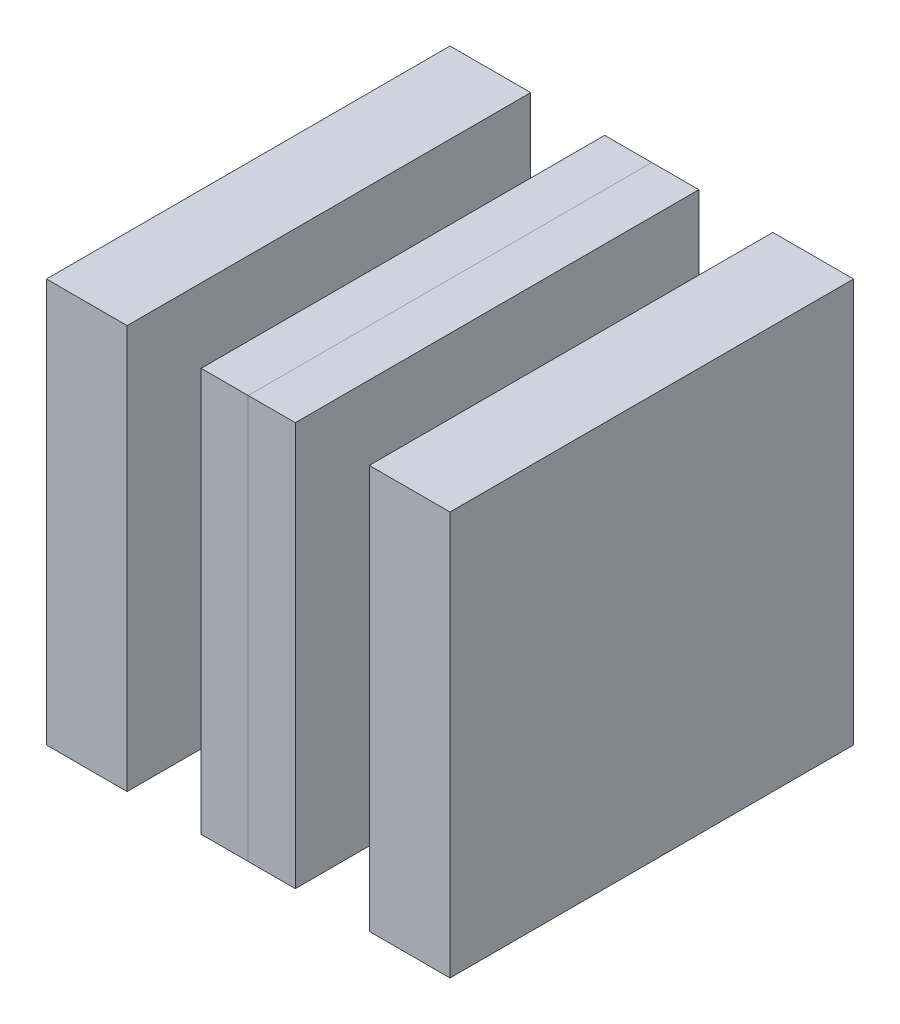
ISO-10303-21;
HEADER;
FILE_DESCRIPTION(('STEP AP214'),'2;1');
FILE_NAME('part.step','',(''),(''),'','','');
FILE_SCHEMA(('AUTOMOTIVE_DESIGN { 1 0 10303 214 1 1 1 1 }'));
ENDSEC;
DATA;
#1=APPLICATION_CONTEXT('core data for automotive mechanical design processes');
#2=APPLICATION_PROTOCOL_DEFINITION('international standard','automotive_design',2000,#1);
#3=PRODUCT_CONTEXT('',#1,'mechanical');
#4=PRODUCT('Part','Part','',(#3));
#5=PRODUCT_RELATED_PRODUCT_CATEGORY('part','',(#4));
#6=PRODUCT_DEFINITION_FORMATION('','',#4);
#7=PRODUCT_DEFINITION_CONTEXT('part definition',#1,'design');
#8=PRODUCT_DEFINITION('design','',#6,#7);
#9=PRODUCT_DEFINITION_SHAPE('','',#8);
#10=(LENGTH_UNIT() NAMED_UNIT(*) SI_UNIT(.MILLI.,.METRE.));
#11=(NAMED_UNIT(*) PLANE_ANGLE_UNIT() SI_UNIT($,.RADIAN.));
#12=(NAMED_UNIT(*) SI_UNIT($,.STERADIAN.) SOLID_ANGLE_UNIT());
#13=UNCERTAINTY_MEASURE_WITH_UNIT(LENGTH_MEASURE(1.E-05),#10,'distance_accuracy_value','');
#14=(GEOMETRIC_REPRESENTATION_CONTEXT(3) GLOBAL_UNCERTAINTY_ASSIGNED_CONTEXT((#13)) GLOBAL_UNIT_ASSIGNED_CONTEXT((#10,
#11,#12)) REPRESENTATION_CONTEXT('',''));
#15=CARTESIAN_POINT('',(0.,0.,0.));
#16=DIRECTION('',(0.,0.,1.));
#17=DIRECTION('',(1.,0.,0.));
#18=AXIS2_PLACEMENT_3D('',#15,#16,#17);
#19=CARTESIAN_POINT('',(15.,0.,15.));
#20=DIRECTION('',(-1.,0.,0.));
#21=DIRECTION('',(0.,0.,-1.));
#22=AXIS2_PLACEMENT_3D('',#19,#20,#21);
#23=PLANE('',#22);
#24=DIRECTION('',(0.,-1.,0.));
#25=VECTOR('',#24,1.);
#26=CARTESIAN_POINT('',(15.,0.,0.));
#27=LINE('',#26,#25);
#28=CARTESIAN_POINT('',(15.,15.,0.));
#29=VERTEX_POINT('',#28);
#30=CARTESIAN_POINT('',(15.,0.,0.));
#31=VERTEX_POINT('',#30);
#32=EDGE_CURVE('E107',#29,#31,#27,.T.);
#33=ORIENTED_EDGE('',*,*,#32,.F.);
#34=DIRECTION('',(0.,0.,-1.));
#35=VECTOR('',#34,1.);
#36=CARTESIAN_POINT('',(15.,15.,15.));
#37=LINE('',#36,#35);
#38=CARTESIAN_POINT('',(15.,15.,15.));
#39=VERTEX_POINT('',#38);
#40=EDGE_CURVE('E106',#39,#29,#37,.T.);
#41=ORIENTED_EDGE('',*,*,#40,.F.);
#42=DIRECTION('',(0.,-1.,0.));
#43=VECTOR('',#42,1.);
#44=CARTESIAN_POINT('',(15.,0.,15.));
#45=LINE('',#44,#43);
#46=CARTESIAN_POINT('',(15.,0.,15.));
#47=VERTEX_POINT('',#46);
#48=EDGE_CURVE('E101',#39,#47,#45,.T.);
#49=ORIENTED_EDGE('',*,*,#48,.T.);
#50=DIRECTION('',(0.,0.,-1.));
#51=VECTOR('',#50,1.);
#52=CARTESIAN_POINT('',(15.,0.,15.));
#53=LINE('',#52,#51);
#54=EDGE_CURVE('E12',#47,#31,#53,.T.);
#55=ORIENTED_EDGE('',*,*,#54,.T.);
#56=EDGE_LOOP('',(#33,#41,#49,#55));
#57=FACE_BOUND('',#56,.T.);
#58=ADVANCED_FACE('F44',(#57),#23,.F.);
#59=CARTESIAN_POINT('',(15.,0.,15.));
#60=DIRECTION('',(0.,1.,0.));
#61=DIRECTION('',(0.,0.,1.));
#62=AXIS2_PLACEMENT_3D('',#59,#60,#61);
#63=PLANE('',#62);
#64=DIRECTION('',(-1.,0.,0.));
#65=VECTOR('',#64,1.);
#66=CARTESIAN_POINT('',(15.,0.,0.));
#67=LINE('',#66,#65);
#68=CARTESIAN_POINT('',(12.,0.,0.));
#69=VERTEX_POINT('',#68);
#70=EDGE_CURVE('E109',#31,#69,#67,.T.);
#71=ORIENTED_EDGE('',*,*,#70,.F.);
#72=ORIENTED_EDGE('',*,*,#54,.F.);
#73=DIRECTION('',(-1.,0.,0.));
#74=VECTOR('',#73,1.);
#75=CARTESIAN_POINT('',(15.,0.,15.));
#76=LINE('',#75,#74);
#77=CARTESIAN_POINT('',(12.,0.,15.));
#78=VERTEX_POINT('',#77);
#79=EDGE_CURVE('E85',#47,#78,#76,.T.);
#80=ORIENTED_EDGE('',*,*,#79,.T.);
#81=DIRECTION('',(0.,0.,-1.));
#82=VECTOR('',#81,1.);
#83=CARTESIAN_POINT('',(12.,0.,15.));
#84=LINE('',#83,#82);
#85=EDGE_CURVE('E52',#78,#69,#84,.T.);
#86=ORIENTED_EDGE('',*,*,#85,.T.);
#87=EDGE_LOOP('',(#71,#72,#80,#86));
#88=FACE_BOUND('',#87,.T.);
#89=ADVANCED_FACE('F99',(#88),#63,.F.);
#90=CARTESIAN_POINT('',(12.,0.,15.));
#91=DIRECTION('',(1.,0.,0.));
#92=DIRECTION('',(0.,0.,1.));
#93=AXIS2_PLACEMENT_3D('',#90,#91,#92);
#94=PLANE('',#93);
#95=DIRECTION('',(0.,1.,0.));
#96=VECTOR('',#95,1.);
#97=CARTESIAN_POINT('',(12.,0.,0.));
#98=LINE('',#97,#96);
#99=CARTESIAN_POINT('',(12.,15.,0.));
#100=VERTEX_POINT('',#99);
#101=EDGE_CURVE('E95',#69,#100,#98,.T.);
#102=ORIENTED_EDGE('',*,*,#101,.F.);
#103=ORIENTED_EDGE('',*,*,#85,.F.);
#104=DIRECTION('',(0.,1.,0.));
#105=VECTOR('',#104,1.);
#106=CARTESIAN_POINT('',(12.,0.,15.));
#107=LINE('',#106,#105);
#108=CARTESIAN_POINT('',(12.,15.,15.));
#109=VERTEX_POINT('',#108);
#110=EDGE_CURVE('E88',#78,#109,#107,.T.);
#111=ORIENTED_EDGE('',*,*,#110,.T.);
#112=DIRECTION('',(0.,0.,-1.));
#113=VECTOR('',#112,1.);
#114=CARTESIAN_POINT('',(12.,15.,15.));
#115=LINE('',#114,#113);
#116=EDGE_CURVE('E98',#109,#100,#115,.T.);
#117=ORIENTED_EDGE('',*,*,#116,.T.);
#118=EDGE_LOOP('',(#102,#103,#111,#117));
#119=FACE_BOUND('',#118,.T.);
#120=ADVANCED_FACE('F94',(#119),#94,.F.);
#121=CARTESIAN_POINT('',(15.,15.,15.));
#122=DIRECTION('',(0.,-1.,0.));
#123=DIRECTION('',(0.,0.,-1.));
#124=AXIS2_PLACEMENT_3D('',#121,#122,#123);
#125=PLANE('',#124);
#126=DIRECTION('',(1.,0.,0.));
#127=VECTOR('',#126,1.);
#128=CARTESIAN_POINT('',(15.,15.,0.));
#129=LINE('',#128,#127);
#130=EDGE_CURVE('E74',#100,#29,#129,.T.);
#131=ORIENTED_EDGE('',*,*,#130,.F.);
#132=ORIENTED_EDGE('',*,*,#116,.F.);
#133=DIRECTION('',(1.,0.,0.));
#134=VECTOR('',#133,1.);
#135=CARTESIAN_POINT('',(15.,15.,15.));
#136=LINE('',#135,#134);
#137=EDGE_CURVE('E60',#109,#39,#136,.T.);
#138=ORIENTED_EDGE('',*,*,#137,.T.);
#139=ORIENTED_EDGE('',*,*,#40,.T.);
#140=EDGE_LOOP('',(#131,#132,#138,#139));
#141=FACE_BOUND('',#140,.T.);
#142=ADVANCED_FACE('F118',(#141),#125,.F.);
#143=CARTESIAN_POINT('',(15.,0.,15.));
#144=DIRECTION('',(0.,0.,-1.));
#145=DIRECTION('',(1.,0.,0.));
#146=AXIS2_PLACEMENT_3D('',#143,#144,#145);
#147=PLANE('',#146);
#148=ORIENTED_EDGE('',*,*,#48,.F.);
#149=ORIENTED_EDGE('',*,*,#137,.F.);
#150=ORIENTED_EDGE('',*,*,#110,.F.);
#151=ORIENTED_EDGE('',*,*,#79,.F.);
#152=EDGE_LOOP('',(#148,#149,#150,#151));
#153=FACE_BOUND('',#152,.T.);
#154=ADVANCED_FACE('F90',(#153),#147,.F.);
#155=CARTESIAN_POINT('',(15.,0.,0.));
#156=DIRECTION('',(0.,0.,-1.));
#157=DIRECTION('',(1.,0.,0.));
#158=AXIS2_PLACEMENT_3D('',#155,#156,#157);
#159=PLANE('',#158);
#160=ORIENTED_EDGE('',*,*,#32,.T.);
#161=ORIENTED_EDGE('',*,*,#70,.T.);
#162=ORIENTED_EDGE('',*,*,#101,.T.);
#163=ORIENTED_EDGE('',*,*,#130,.T.);
#164=EDGE_LOOP('',(#160,#161,#162,#163));
#165=FACE_BOUND('',#164,.T.);
#166=ADVANCED_FACE('F114',(#165),#159,.T.);
#167=CLOSED_SHELL('',(#58,#89,#120,#142,#154,#166));
#168=MANIFOLD_SOLID_BREP('B2',#167);
#169=CARTESIAN_POINT('',(9.25,15.,15.));
#170=DIRECTION('',(-1.,0.,0.));
#171=DIRECTION('',(0.,1.,0.));
#172=AXIS2_PLACEMENT_3D('',#169,#170,#171);
#173=PLANE('',#172);
#174=DIRECTION('',(0.,-1.,0.));
#175=VECTOR('',#174,1.);
#176=CARTESIAN_POINT('',(9.25,15.,0.));
#177=LINE('',#176,#175);
#178=CARTESIAN_POINT('',(9.25,15.,0.));
#179=VERTEX_POINT('',#178);
#180=CARTESIAN_POINT('',(9.25,0.,0.));
#181=VERTEX_POINT('',#180);
#182=EDGE_CURVE('E241',#179,#181,#177,.T.);
#183=ORIENTED_EDGE('',*,*,#182,.F.);
#184=DIRECTION('',(0.,0.,-1.));
#185=VECTOR('',#184,1.);
#186=CARTESIAN_POINT('',(9.25,15.,15.));
#187=LINE('',#186,#185);
#188=CARTESIAN_POINT('',(9.25,15.,15.));
#189=VERTEX_POINT('',#188);
#190=EDGE_CURVE('E240',#189,#179,#187,.T.);
#191=ORIENTED_EDGE('',*,*,#190,.F.);
#192=DIRECTION('',(0.,-1.,0.));
#193=VECTOR('',#192,1.);
#194=CARTESIAN_POINT('',(9.25,15.,15.));
#195=LINE('',#194,#193);
#196=CARTESIAN_POINT('',(9.25,0.,15.));
#197=VERTEX_POINT('',#196);
#198=EDGE_CURVE('E235',#189,#197,#195,.T.);
#199=ORIENTED_EDGE('',*,*,#198,.T.);
#200=DIRECTION('',(0.,0.,-1.));
#201=VECTOR('',#200,1.);
#202=CARTESIAN_POINT('',(9.25,0.,15.));
#203=LINE('',#202,#201);
#204=EDGE_CURVE('E42',#197,#181,#203,.T.);
#205=ORIENTED_EDGE('',*,*,#204,.T.);
#206=EDGE_LOOP('',(#183,#191,#199,#205));
#207=FACE_BOUND('',#206,.T.);
#208=ADVANCED_FACE('F178',(#207),#173,.F.);
#209=CARTESIAN_POINT('',(9.25,0.,15.));
#210=DIRECTION('',(0.,1.,0.));
#211=DIRECTION('',(0.,0.,1.));
#212=AXIS2_PLACEMENT_3D('',#209,#210,#211);
#213=PLANE('',#212);
#214=DIRECTION('',(-1.,0.,0.));
#215=VECTOR('',#214,1.);
#216=CARTESIAN_POINT('',(9.25,0.,0.));
#217=LINE('',#216,#215);
#218=CARTESIAN_POINT('',(7.5,0.,0.));
#219=VERTEX_POINT('',#218);
#220=EDGE_CURVE('E243',#181,#219,#217,.T.);
#221=ORIENTED_EDGE('',*,*,#220,.F.);
#222=ORIENTED_EDGE('',*,*,#204,.F.);
#223=DIRECTION('',(-1.,0.,0.));
#224=VECTOR('',#223,1.);
#225=CARTESIAN_POINT('',(9.25,0.,15.));
#226=LINE('',#225,#224);
#227=CARTESIAN_POINT('',(7.5,0.,15.));
#228=VERTEX_POINT('',#227);
#229=EDGE_CURVE('E219',#197,#228,#226,.T.);
#230=ORIENTED_EDGE('',*,*,#229,.T.);
#231=DIRECTION('',(0.,0.,-1.));
#232=VECTOR('',#231,1.);
#233=CARTESIAN_POINT('',(7.5,0.,15.));
#234=LINE('',#233,#232);
#235=EDGE_CURVE('E186',#228,#219,#234,.T.);
#236=ORIENTED_EDGE('',*,*,#235,.T.);
#237=EDGE_LOOP('',(#221,#222,#230,#236));
#238=FACE_BOUND('',#237,.T.);
#239=ADVANCED_FACE('F233',(#238),#213,.F.);
#240=CARTESIAN_POINT('',(7.5,15.,15.));
#241=DIRECTION('',(1.,0.,0.));
#242=DIRECTION('',(0.,-1.,0.));
#243=AXIS2_PLACEMENT_3D('',#240,#241,#242);
#244=PLANE('',#243);
#245=DIRECTION('',(0.,1.,0.));
#246=VECTOR('',#245,1.);
#247=CARTESIAN_POINT('',(7.5,15.,0.));
#248=LINE('',#247,#246);
#249=CARTESIAN_POINT('',(7.5,15.,0.));
#250=VERTEX_POINT('',#249);
#251=EDGE_CURVE('E229',#219,#250,#248,.T.);
#252=ORIENTED_EDGE('',*,*,#251,.F.);
#253=ORIENTED_EDGE('',*,*,#235,.F.);
#254=DIRECTION('',(0.,1.,0.));
#255=VECTOR('',#254,1.);
#256=CARTESIAN_POINT('',(7.5,15.,15.));
#257=LINE('',#256,#255);
#258=CARTESIAN_POINT('',(7.5,15.,15.));
#259=VERTEX_POINT('',#258);
#260=EDGE_CURVE('E222',#228,#259,#257,.T.);
#261=ORIENTED_EDGE('',*,*,#260,.T.);
#262=DIRECTION('',(0.,0.,-1.));
#263=VECTOR('',#262,1.);
#264=CARTESIAN_POINT('',(7.5,15.,15.));
#265=LINE('',#264,#263);
#266=EDGE_CURVE('E232',#259,#250,#265,.T.);
#267=ORIENTED_EDGE('',*,*,#266,.T.);
#268=EDGE_LOOP('',(#252,#253,#261,#267));
#269=FACE_BOUND('',#268,.T.);
#270=ADVANCED_FACE('F228',(#269),#244,.F.);
#271=CARTESIAN_POINT('',(9.25,15.,15.));
#272=DIRECTION('',(0.,-1.,0.));
#273=DIRECTION('',(0.,0.,-1.));
#274=AXIS2_PLACEMENT_3D('',#271,#272,#273);
#275=PLANE('',#274);
#276=DIRECTION('',(1.,0.,0.));
#277=VECTOR('',#276,1.);
#278=CARTESIAN_POINT('',(9.25,15.,0.));
#279=LINE('',#278,#277);
#280=EDGE_CURVE('E208',#250,#179,#279,.T.);
#281=ORIENTED_EDGE('',*,*,#280,.F.);
#282=ORIENTED_EDGE('',*,*,#266,.F.);
#283=DIRECTION('',(1.,0.,0.));
#284=VECTOR('',#283,1.);
#285=CARTESIAN_POINT('',(9.25,15.,15.));
#286=LINE('',#285,#284);
#287=EDGE_CURVE('E194',#259,#189,#286,.T.);
#288=ORIENTED_EDGE('',*,*,#287,.T.);
#289=ORIENTED_EDGE('',*,*,#190,.T.);
#290=EDGE_LOOP('',(#281,#282,#288,#289));
#291=FACE_BOUND('',#290,.T.);
#292=ADVANCED_FACE('F252',(#291),#275,.F.);
#293=CARTESIAN_POINT('',(15.,0.,15.));
#294=DIRECTION('',(0.,0.,1.));
#295=DIRECTION('',(-1.,0.,0.));
#296=AXIS2_PLACEMENT_3D('',#293,#294,#295);
#297=PLANE('',#296);
#298=ORIENTED_EDGE('',*,*,#198,.F.);
#299=ORIENTED_EDGE('',*,*,#287,.F.);
#300=ORIENTED_EDGE('',*,*,#260,.F.);
#301=ORIENTED_EDGE('',*,*,#229,.F.);
#302=EDGE_LOOP('',(#298,#299,#300,#301));
#303=FACE_BOUND('',#302,.T.);
#304=ADVANCED_FACE('F224',(#303),#297,.T.);
#305=CARTESIAN_POINT('',(15.,0.,0.));
#306=DIRECTION('',(0.,0.,1.));
#307=DIRECTION('',(-1.,0.,0.));
#308=AXIS2_PLACEMENT_3D('',#305,#306,#307);
#309=PLANE('',#308);
#310=ORIENTED_EDGE('',*,*,#182,.T.);
#311=ORIENTED_EDGE('',*,*,#220,.T.);
#312=ORIENTED_EDGE('',*,*,#251,.T.);
#313=ORIENTED_EDGE('',*,*,#280,.T.);
#314=EDGE_LOOP('',(#310,#311,#312,#313));
#315=FACE_BOUND('',#314,.T.);
#316=ADVANCED_FACE('F248',(#315),#309,.F.);
#317=CLOSED_SHELL('',(#208,#239,#270,#292,#304,#316));
#318=MANIFOLD_SOLID_BREP('B6',#317);
#319=CARTESIAN_POINT('',(5.75,15.,15.));
#320=DIRECTION('',(1.,0.,0.));
#321=DIRECTION('',(0.,1.,0.));
#322=AXIS2_PLACEMENT_3D('',#319,#320,#321);
#323=PLANE('',#322);
#324=DIRECTION('',(0.,-1.,0.));
#325=VECTOR('',#324,1.);
#326=CARTESIAN_POINT('',(5.75,15.,0.));
#327=LINE('',#326,#325);
#328=CARTESIAN_POINT('',(5.75,15.,0.));
#329=VERTEX_POINT('',#328);
#330=CARTESIAN_POINT('',(5.75,0.,0.));
#331=VERTEX_POINT('',#330);
#332=EDGE_CURVE('E374',#329,#331,#327,.T.);
#333=ORIENTED_EDGE('',*,*,#332,.T.);
#334=DIRECTION('',(0.,0.,-1.));
#335=VECTOR('',#334,1.);
#336=CARTESIAN_POINT('',(5.75,0.,15.));
#337=LINE('',#336,#335);
#338=CARTESIAN_POINT('',(5.75,0.,15.));
#339=VERTEX_POINT('',#338);
#340=EDGE_CURVE('E176',#339,#331,#337,.T.);
#341=ORIENTED_EDGE('',*,*,#340,.F.);
#342=DIRECTION('',(0.,-1.,0.));
#343=VECTOR('',#342,1.);
#344=CARTESIAN_POINT('',(5.75,15.,15.));
#345=LINE('',#344,#343);
#346=CARTESIAN_POINT('',(5.75,15.,15.));
#347=VERTEX_POINT('',#346);
#348=EDGE_CURVE('E362',#347,#339,#345,.T.);
#349=ORIENTED_EDGE('',*,*,#348,.F.);
#350=DIRECTION('',(0.,0.,-1.));
#351=VECTOR('',#350,1.);
#352=CARTESIAN_POINT('',(5.75,15.,15.));
#353=LINE('',#352,#351);
#354=EDGE_CURVE('E370',#347,#329,#353,.T.);
#355=ORIENTED_EDGE('',*,*,#354,.T.);
#356=EDGE_LOOP('',(#333,#341,#349,#355));
#357=FACE_BOUND('',#356,.T.);
#358=ADVANCED_FACE('F311',(#357),#323,.F.);
#359=CARTESIAN_POINT('',(5.75,0.,15.));
#360=DIRECTION('',(0.,1.,0.));
#361=DIRECTION('',(0.,0.,1.));
#362=AXIS2_PLACEMENT_3D('',#359,#360,#361);
#363=PLANE('',#362);
#364=DIRECTION('',(1.,0.,0.));
#365=VECTOR('',#364,1.);
#366=CARTESIAN_POINT('',(5.75,0.,0.));
#367=LINE('',#366,#365);
#368=CARTESIAN_POINT('',(7.5,0.,0.));
#369=VERTEX_POINT('',#368);
#370=EDGE_CURVE('E366',#331,#369,#367,.T.);
#371=ORIENTED_EDGE('',*,*,#370,.T.);
#372=DIRECTION('',(0.,0.,-1.));
#373=VECTOR('',#372,1.);
#374=CARTESIAN_POINT('',(7.5,0.,15.));
#375=LINE('',#374,#373);
#376=CARTESIAN_POINT('',(7.5,0.,15.));
#377=VERTEX_POINT('',#376);
#378=EDGE_CURVE('E319',#377,#369,#375,.T.);
#379=ORIENTED_EDGE('',*,*,#378,.F.);
#380=DIRECTION('',(1.,0.,0.));
#381=VECTOR('',#380,1.);
#382=CARTESIAN_POINT('',(5.75,0.,15.));
#383=LINE('',#382,#381);
#384=EDGE_CURVE('E357',#339,#377,#383,.T.);
#385=ORIENTED_EDGE('',*,*,#384,.F.);
#386=ORIENTED_EDGE('',*,*,#340,.T.);
#387=EDGE_LOOP('',(#371,#379,#385,#386));
#388=FACE_BOUND('',#387,.T.);
#389=ADVANCED_FACE('F365',(#388),#363,.F.);
#390=CARTESIAN_POINT('',(7.5,15.,15.));
#391=DIRECTION('',(-1.,0.,0.));
#392=DIRECTION('',(0.,-1.,0.));
#393=AXIS2_PLACEMENT_3D('',#390,#391,#392);
#394=PLANE('',#393);
#395=DIRECTION('',(0.,1.,0.));
#396=VECTOR('',#395,1.);
#397=CARTESIAN_POINT('',(7.5,15.,0.));
#398=LINE('',#397,#396);
#399=CARTESIAN_POINT('',(7.5,15.,0.));
#400=VERTEX_POINT('',#399);
#401=EDGE_CURVE('E344',#369,#400,#398,.T.);
#402=ORIENTED_EDGE('',*,*,#401,.T.);
#403=DIRECTION('',(0.,0.,-1.));
#404=VECTOR('',#403,1.);
#405=CARTESIAN_POINT('',(7.5,15.,15.));
#406=LINE('',#405,#404);
#407=CARTESIAN_POINT('',(7.5,15.,15.));
#408=VERTEX_POINT('',#407);
#409=EDGE_CURVE('E367',#408,#400,#406,.T.);
#410=ORIENTED_EDGE('',*,*,#409,.F.);
#411=DIRECTION('',(0.,1.,0.));
#412=VECTOR('',#411,1.);
#413=CARTESIAN_POINT('',(7.5,15.,15.));
#414=LINE('',#413,#412);
#415=EDGE_CURVE('E360',#377,#408,#414,.T.);
#416=ORIENTED_EDGE('',*,*,#415,.F.);
#417=ORIENTED_EDGE('',*,*,#378,.T.);
#418=EDGE_LOOP('',(#402,#410,#416,#417));
#419=FACE_BOUND('',#418,.T.);
#420=ADVANCED_FACE('F368',(#419),#394,.F.);
#421=CARTESIAN_POINT('',(5.75,15.,15.));
#422=DIRECTION('',(0.,-1.,0.));
#423=DIRECTION('',(0.,0.,-1.));
#424=AXIS2_PLACEMENT_3D('',#421,#422,#423);
#425=PLANE('',#424);
#426=DIRECTION('',(-1.,0.,0.));
#427=VECTOR('',#426,1.);
#428=CARTESIAN_POINT('',(5.75,15.,0.));
#429=LINE('',#428,#427);
#430=EDGE_CURVE('E350',#400,#329,#429,.T.);
#431=ORIENTED_EDGE('',*,*,#430,.T.);
#432=ORIENTED_EDGE('',*,*,#354,.F.);
#433=DIRECTION('',(-1.,0.,0.));
#434=VECTOR('',#433,1.);
#435=CARTESIAN_POINT('',(5.75,15.,15.));
#436=LINE('',#435,#434);
#437=EDGE_CURVE('E327',#408,#347,#436,.T.);
#438=ORIENTED_EDGE('',*,*,#437,.F.);
#439=ORIENTED_EDGE('',*,*,#409,.T.);
#440=EDGE_LOOP('',(#431,#432,#438,#439));
#441=FACE_BOUND('',#440,.T.);
#442=ADVANCED_FACE('F381',(#441),#425,.F.);
#443=CARTESIAN_POINT('',(0.,0.,15.));
#444=DIRECTION('',(0.,0.,1.));
#445=DIRECTION('',(1.,0.,0.));
#446=AXIS2_PLACEMENT_3D('',#443,#444,#445);
#447=PLANE('',#446);
#448=ORIENTED_EDGE('',*,*,#348,.T.);
#449=ORIENTED_EDGE('',*,*,#384,.T.);
#450=ORIENTED_EDGE('',*,*,#415,.T.);
#451=ORIENTED_EDGE('',*,*,#437,.T.);
#452=EDGE_LOOP('',(#448,#449,#450,#451));
#453=FACE_BOUND('',#452,.T.);
#454=ADVANCED_FACE('F358',(#453),#447,.T.);
#455=CARTESIAN_POINT('',(0.,0.,0.));
#456=DIRECTION('',(0.,0.,1.));
#457=DIRECTION('',(1.,0.,0.));
#458=AXIS2_PLACEMENT_3D('',#455,#456,#457);
#459=PLANE('',#458);
#460=ORIENTED_EDGE('',*,*,#332,.F.);
#461=ORIENTED_EDGE('',*,*,#430,.F.);
#462=ORIENTED_EDGE('',*,*,#401,.F.);
#463=ORIENTED_EDGE('',*,*,#370,.F.);
#464=EDGE_LOOP('',(#460,#461,#462,#463));
#465=FACE_BOUND('',#464,.T.);
#466=ADVANCED_FACE('F384',(#465),#459,.F.);
#467=CLOSED_SHELL('',(#358,#389,#420,#442,#454,#466));
#468=MANIFOLD_SOLID_BREP('B36',#467);
#469=CARTESIAN_POINT('',(0.,0.,15.));
#470=DIRECTION('',(1.,0.,0.));
#471=DIRECTION('',(0.,0.,-1.));
#472=AXIS2_PLACEMENT_3D('',#469,#470,#471);
#473=PLANE('',#472);
#474=DIRECTION('',(0.,-1.,0.));
#475=VECTOR('',#474,1.);
#476=CARTESIAN_POINT('',(0.,0.,0.));
#477=LINE('',#476,#475);
#478=CARTESIAN_POINT('',(0.,15.,0.));
#479=VERTEX_POINT('',#478);
#480=CARTESIAN_POINT('',(0.,0.,0.));
#481=VERTEX_POINT('',#480);
#482=EDGE_CURVE('E498',#479,#481,#477,.T.);
#483=ORIENTED_EDGE('',*,*,#482,.T.);
#484=DIRECTION('',(0.,0.,-1.));
#485=VECTOR('',#484,1.);
#486=CARTESIAN_POINT('',(0.,0.,15.));
#487=LINE('',#486,#485);
#488=CARTESIAN_POINT('',(0.,0.,15.));
#489=VERTEX_POINT('',#488);
#490=EDGE_CURVE('E309',#489,#481,#487,.T.);
#491=ORIENTED_EDGE('',*,*,#490,.F.);
#492=DIRECTION('',(0.,-1.,0.));
#493=VECTOR('',#492,1.);
#494=CARTESIAN_POINT('',(0.,0.,15.));
#495=LINE('',#494,#493);
#496=CARTESIAN_POINT('',(0.,15.,15.));
#497=VERTEX_POINT('',#496);
#498=EDGE_CURVE('E486',#497,#489,#495,.T.);
#499=ORIENTED_EDGE('',*,*,#498,.F.);
#500=DIRECTION('',(0.,0.,-1.));
#501=VECTOR('',#500,1.);
#502=CARTESIAN_POINT('',(0.,15.,15.));
#503=LINE('',#502,#501);
#504=EDGE_CURVE('E494',#497,#479,#503,.T.);
#505=ORIENTED_EDGE('',*,*,#504,.T.);
#506=EDGE_LOOP('',(#483,#491,#499,#505));
#507=FACE_BOUND('',#506,.T.);
#508=ADVANCED_FACE('F435',(#507),#473,.F.);
#509=CARTESIAN_POINT('',(0.,0.,15.));
#510=DIRECTION('',(0.,1.,0.));
#511=DIRECTION('',(0.,0.,1.));
#512=AXIS2_PLACEMENT_3D('',#509,#510,#511);
#513=PLANE('',#512);
#514=DIRECTION('',(1.,0.,0.));
#515=VECTOR('',#514,1.);
#516=CARTESIAN_POINT('',(0.,0.,0.));
#517=LINE('',#516,#515);
#518=CARTESIAN_POINT('',(3.,0.,0.));
#519=VERTEX_POINT('',#518);
#520=EDGE_CURVE('E490',#481,#519,#517,.T.);
#521=ORIENTED_EDGE('',*,*,#520,.T.);
#522=DIRECTION('',(0.,0.,-1.));
#523=VECTOR('',#522,1.);
#524=CARTESIAN_POINT('',(3.,0.,15.));
#525=LINE('',#524,#523);
#526=CARTESIAN_POINT('',(3.,0.,15.));
#527=VERTEX_POINT('',#526);
#528=EDGE_CURVE('E443',#527,#519,#525,.T.);
#529=ORIENTED_EDGE('',*,*,#528,.F.);
#530=DIRECTION('',(1.,0.,0.));
#531=VECTOR('',#530,1.);
#532=CARTESIAN_POINT('',(0.,0.,15.));
#533=LINE('',#532,#531);
#534=EDGE_CURVE('E481',#489,#527,#533,.T.);
#535=ORIENTED_EDGE('',*,*,#534,.F.);
#536=ORIENTED_EDGE('',*,*,#490,.T.);
#537=EDGE_LOOP('',(#521,#529,#535,#536));
#538=FACE_BOUND('',#537,.T.);
#539=ADVANCED_FACE('F489',(#538),#513,.F.);
#540=CARTESIAN_POINT('',(3.,0.,15.));
#541=DIRECTION('',(-1.,0.,0.));
#542=DIRECTION('',(0.,0.,1.));
#543=AXIS2_PLACEMENT_3D('',#540,#541,#542);
#544=PLANE('',#543);
#545=DIRECTION('',(0.,1.,0.));
#546=VECTOR('',#545,1.);
#547=CARTESIAN_POINT('',(3.,0.,0.));
#548=LINE('',#547,#546);
#549=CARTESIAN_POINT('',(3.,15.,0.));
#550=VERTEX_POINT('',#549);
#551=EDGE_CURVE('E468',#519,#550,#548,.T.);
#552=ORIENTED_EDGE('',*,*,#551,.T.);
#553=DIRECTION('',(0.,0.,-1.));
#554=VECTOR('',#553,1.);
#555=CARTESIAN_POINT('',(3.,15.,15.));
#556=LINE('',#555,#554);
#557=CARTESIAN_POINT('',(3.,15.,15.));
#558=VERTEX_POINT('',#557);
#559=EDGE_CURVE('E491',#558,#550,#556,.T.);
#560=ORIENTED_EDGE('',*,*,#559,.F.);
#561=DIRECTION('',(0.,1.,0.));
#562=VECTOR('',#561,1.);
#563=CARTESIAN_POINT('',(3.,0.,15.));
#564=LINE('',#563,#562);
#565=EDGE_CURVE('E484',#527,#558,#564,.T.);
#566=ORIENTED_EDGE('',*,*,#565,.F.);
#567=ORIENTED_EDGE('',*,*,#528,.T.);
#568=EDGE_LOOP('',(#552,#560,#566,#567));
#569=FACE_BOUND('',#568,.T.);
#570=ADVANCED_FACE('F492',(#569),#544,.F.);
#571=CARTESIAN_POINT('',(0.,15.,15.));
#572=DIRECTION('',(0.,-1.,0.));
#573=DIRECTION('',(0.,0.,-1.));
#574=AXIS2_PLACEMENT_3D('',#571,#572,#573);
#575=PLANE('',#574);
#576=DIRECTION('',(-1.,0.,0.));
#577=VECTOR('',#576,1.);
#578=CARTESIAN_POINT('',(0.,15.,0.));
#579=LINE('',#578,#577);
#580=EDGE_CURVE('E474',#550,#479,#579,.T.);
#581=ORIENTED_EDGE('',*,*,#580,.T.);
#582=ORIENTED_EDGE('',*,*,#504,.F.);
#583=DIRECTION('',(-1.,0.,0.));
#584=VECTOR('',#583,1.);
#585=CARTESIAN_POINT('',(0.,15.,15.));
#586=LINE('',#585,#584);
#587=EDGE_CURVE('E451',#558,#497,#586,.T.);
#588=ORIENTED_EDGE('',*,*,#587,.F.);
#589=ORIENTED_EDGE('',*,*,#559,.T.);
#590=EDGE_LOOP('',(#581,#582,#588,#589));
#591=FACE_BOUND('',#590,.T.);
#592=ADVANCED_FACE('F505',(#591),#575,.F.);
#593=CARTESIAN_POINT('',(0.,0.,15.));
#594=DIRECTION('',(0.,0.,-1.));
#595=DIRECTION('',(-1.,0.,0.));
#596=AXIS2_PLACEMENT_3D('',#593,#594,#595);
#597=PLANE('',#596);
#598=ORIENTED_EDGE('',*,*,#498,.T.);
#599=ORIENTED_EDGE('',*,*,#534,.T.);
#600=ORIENTED_EDGE('',*,*,#565,.T.);
#601=ORIENTED_EDGE('',*,*,#587,.T.);
#602=EDGE_LOOP('',(#598,#599,#600,#601));
#603=FACE_BOUND('',#602,.T.);
#604=ADVANCED_FACE('F482',(#603),#597,.F.);
#605=CARTESIAN_POINT('',(0.,0.,0.));
#606=DIRECTION('',(0.,0.,-1.));
#607=DIRECTION('',(-1.,0.,0.));
#608=AXIS2_PLACEMENT_3D('',#605,#606,#607);
#609=PLANE('',#608);
#610=ORIENTED_EDGE('',*,*,#482,.F.);
#611=ORIENTED_EDGE('',*,*,#580,.F.);
#612=ORIENTED_EDGE('',*,*,#551,.F.);
#613=ORIENTED_EDGE('',*,*,#520,.F.);
#614=EDGE_LOOP('',(#610,#611,#612,#613));
#615=FACE_BOUND('',#614,.T.);
#616=ADVANCED_FACE('F508',(#615),#609,.T.);
#617=CLOSED_SHELL('',(#508,#539,#570,#592,#604,#616));
#618=MANIFOLD_SOLID_BREP('B170',#617);
#619=ADVANCED_BREP_SHAPE_REPRESENTATION('',(#18,#168,#318,#468,#618),#14);
#620=SHAPE_DEFINITION_REPRESENTATION(#9,#619);
ENDSEC;
END-ISO-10303-21;
